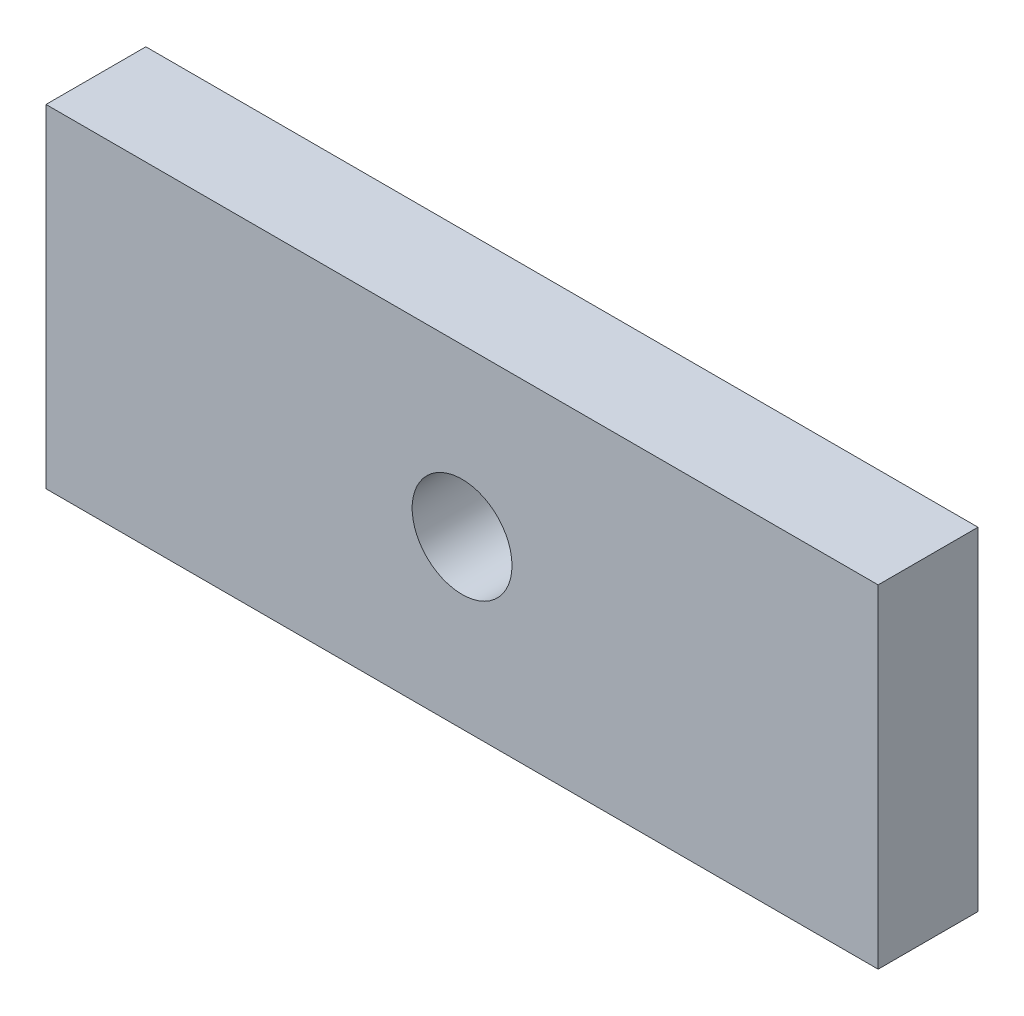
ISO-10303-21;
HEADER;
FILE_DESCRIPTION(('STEP AP214'),'2;1');
FILE_NAME('part.step','',(''),(''),'','','');
FILE_SCHEMA(('AUTOMOTIVE_DESIGN { 1 0 10303 214 1 1 1 1 }'));
ENDSEC;
DATA;
#1=APPLICATION_CONTEXT('core data for automotive mechanical design processes');
#2=APPLICATION_PROTOCOL_DEFINITION('international standard','automotive_design',2000,#1);
#3=PRODUCT_CONTEXT('',#1,'mechanical');
#4=PRODUCT('Part','Part','',(#3));
#5=PRODUCT_RELATED_PRODUCT_CATEGORY('part','',(#4));
#6=PRODUCT_DEFINITION_FORMATION('','',#4);
#7=PRODUCT_DEFINITION_CONTEXT('part definition',#1,'design');
#8=PRODUCT_DEFINITION('design','',#6,#7);
#9=PRODUCT_DEFINITION_SHAPE('','',#8);
#10=(LENGTH_UNIT() NAMED_UNIT(*) SI_UNIT(.MILLI.,.METRE.));
#11=(NAMED_UNIT(*) PLANE_ANGLE_UNIT() SI_UNIT($,.RADIAN.));
#12=(NAMED_UNIT(*) SI_UNIT($,.STERADIAN.) SOLID_ANGLE_UNIT());
#13=UNCERTAINTY_MEASURE_WITH_UNIT(LENGTH_MEASURE(1.E-05),#10,'distance_accuracy_value','');
#14=(GEOMETRIC_REPRESENTATION_CONTEXT(3) GLOBAL_UNCERTAINTY_ASSIGNED_CONTEXT((#13)) GLOBAL_UNIT_ASSIGNED_CONTEXT((#10,
#11,#12)) REPRESENTATION_CONTEXT('',''));
#15=CARTESIAN_POINT('',(0.,0.,0.));
#16=DIRECTION('',(0.,0.,1.));
#17=DIRECTION('',(1.,0.,0.));
#18=AXIS2_PLACEMENT_3D('',#15,#16,#17);
#19=CARTESIAN_POINT('',(0.,0.,3.));
#20=DIRECTION('',(0.,0.,-1.));
#21=DIRECTION('',(-1.,0.,0.));
#22=AXIS2_PLACEMENT_3D('',#19,#20,#21);
#23=PLANE('',#22);
#24=DIRECTION('',(0.,-1.,0.));
#25=VECTOR('',#24,1.);
#26=CARTESIAN_POINT('',(0.,0.,3.));
#27=LINE('',#26,#25);
#28=CARTESIAN_POINT('',(0.,10.,3.));
#29=VERTEX_POINT('',#28);
#30=CARTESIAN_POINT('',(0.,0.,3.));
#31=VERTEX_POINT('',#30);
#32=EDGE_CURVE('E86',#29,#31,#27,.T.);
#33=ORIENTED_EDGE('',*,*,#32,.T.);
#34=DIRECTION('',(1.,0.,0.));
#35=VECTOR('',#34,1.);
#36=CARTESIAN_POINT('',(0.,0.,3.));
#37=LINE('',#36,#35);
#38=CARTESIAN_POINT('',(25.,0.,3.));
#39=VERTEX_POINT('',#38);
#40=EDGE_CURVE('E81',#31,#39,#37,.T.);
#41=ORIENTED_EDGE('',*,*,#40,.T.);
#42=DIRECTION('',(0.,1.,0.));
#43=VECTOR('',#42,1.);
#44=CARTESIAN_POINT('',(25.,0.,3.));
#45=LINE('',#44,#43);
#46=CARTESIAN_POINT('',(25.,10.,3.));
#47=VERTEX_POINT('',#46);
#48=EDGE_CURVE('E84',#39,#47,#45,.T.);
#49=ORIENTED_EDGE('',*,*,#48,.T.);
#50=DIRECTION('',(-1.,0.,0.));
#51=VECTOR('',#50,1.);
#52=CARTESIAN_POINT('',(0.,10.,3.));
#53=LINE('',#52,#51);
#54=EDGE_CURVE('E51',#47,#29,#53,.T.);
#55=ORIENTED_EDGE('',*,*,#54,.T.);
#56=EDGE_LOOP('',(#33,#41,#49,#55));
#57=FACE_BOUND('',#56,.T.);
#58=CARTESIAN_POINT('',(12.5,5.,3.));
#59=DIRECTION('',(0.,0.,1.));
#60=DIRECTION('',(1.,0.,0.));
#61=AXIS2_PLACEMENT_3D('',#58,#59,#60);
#62=CIRCLE('',#61,1.5);
#63=CARTESIAN_POINT('',(14.,5.,3.));
#64=VERTEX_POINT('',#63);
#65=EDGE_CURVE('E101',#64,#64,#62,.T.);
#66=ORIENTED_EDGE('',*,*,#65,.F.);
#67=EDGE_LOOP('',(#66));
#68=FACE_BOUND('',#67,.T.);
#69=ADVANCED_FACE('F34',(#57,#68),#23,.F.);
#70=CARTESIAN_POINT('',(0.,0.,0.));
#71=DIRECTION('',(0.,0.,-1.));
#72=DIRECTION('',(-1.,0.,0.));
#73=AXIS2_PLACEMENT_3D('',#70,#71,#72);
#74=PLANE('',#73);
#75=DIRECTION('',(0.,-1.,0.));
#76=VECTOR('',#75,1.);
#77=CARTESIAN_POINT('',(0.,0.,0.));
#78=LINE('',#77,#76);
#79=CARTESIAN_POINT('',(0.,10.,0.));
#80=VERTEX_POINT('',#79);
#81=CARTESIAN_POINT('',(0.,0.,0.));
#82=VERTEX_POINT('',#81);
#83=EDGE_CURVE('E98',#80,#82,#78,.T.);
#84=ORIENTED_EDGE('',*,*,#83,.F.);
#85=DIRECTION('',(-1.,0.,0.));
#86=VECTOR('',#85,1.);
#87=CARTESIAN_POINT('',(0.,10.,0.));
#88=LINE('',#87,#86);
#89=CARTESIAN_POINT('',(25.,10.,0.));
#90=VERTEX_POINT('',#89);
#91=EDGE_CURVE('E74',#90,#80,#88,.T.);
#92=ORIENTED_EDGE('',*,*,#91,.F.);
#93=DIRECTION('',(0.,1.,0.));
#94=VECTOR('',#93,1.);
#95=CARTESIAN_POINT('',(25.,0.,0.));
#96=LINE('',#95,#94);
#97=CARTESIAN_POINT('',(25.,0.,0.));
#98=VERTEX_POINT('',#97);
#99=EDGE_CURVE('E68',#98,#90,#96,.T.);
#100=ORIENTED_EDGE('',*,*,#99,.F.);
#101=DIRECTION('',(1.,0.,0.));
#102=VECTOR('',#101,1.);
#103=CARTESIAN_POINT('',(0.,0.,0.));
#104=LINE('',#103,#102);
#105=EDGE_CURVE('E90',#82,#98,#104,.T.);
#106=ORIENTED_EDGE('',*,*,#105,.F.);
#107=EDGE_LOOP('',(#84,#92,#100,#106));
#108=FACE_BOUND('',#107,.T.);
#109=CARTESIAN_POINT('',(12.5,5.,0.));
#110=DIRECTION('',(0.,0.,1.));
#111=DIRECTION('',(1.,0.,0.));
#112=AXIS2_PLACEMENT_3D('',#109,#110,#111);
#113=CIRCLE('',#112,1.5);
#114=CARTESIAN_POINT('',(14.,5.,0.));
#115=VERTEX_POINT('',#114);
#116=EDGE_CURVE('E113',#115,#115,#113,.T.);
#117=ORIENTED_EDGE('',*,*,#116,.T.);
#118=EDGE_LOOP('',(#117));
#119=FACE_BOUND('',#118,.T.);
#120=ADVANCED_FACE('F109',(#108,#119),#74,.T.);
#121=CARTESIAN_POINT('',(0.,0.,3.));
#122=DIRECTION('',(1.,0.,0.));
#123=DIRECTION('',(0.,0.,-1.));
#124=AXIS2_PLACEMENT_3D('',#121,#122,#123);
#125=PLANE('',#124);
#126=ORIENTED_EDGE('',*,*,#83,.T.);
#127=DIRECTION('',(0.,0.,-1.));
#128=VECTOR('',#127,1.);
#129=CARTESIAN_POINT('',(0.,0.,3.));
#130=LINE('',#129,#128);
#131=EDGE_CURVE('E11',#31,#82,#130,.T.);
#132=ORIENTED_EDGE('',*,*,#131,.F.);
#133=ORIENTED_EDGE('',*,*,#32,.F.);
#134=DIRECTION('',(0.,0.,-1.));
#135=VECTOR('',#134,1.);
#136=CARTESIAN_POINT('',(0.,10.,3.));
#137=LINE('',#136,#135);
#138=EDGE_CURVE('E94',#29,#80,#137,.T.);
#139=ORIENTED_EDGE('',*,*,#138,.T.);
#140=EDGE_LOOP('',(#126,#132,#133,#139));
#141=FACE_BOUND('',#140,.T.);
#142=ADVANCED_FACE('F36',(#141),#125,.F.);
#143=CARTESIAN_POINT('',(0.,0.,3.));
#144=DIRECTION('',(0.,1.,0.));
#145=DIRECTION('',(0.,0.,1.));
#146=AXIS2_PLACEMENT_3D('',#143,#144,#145);
#147=PLANE('',#146);
#148=ORIENTED_EDGE('',*,*,#105,.T.);
#149=DIRECTION('',(0.,0.,-1.));
#150=VECTOR('',#149,1.);
#151=CARTESIAN_POINT('',(25.,0.,3.));
#152=LINE('',#151,#150);
#153=EDGE_CURVE('E43',#39,#98,#152,.T.);
#154=ORIENTED_EDGE('',*,*,#153,.F.);
#155=ORIENTED_EDGE('',*,*,#40,.F.);
#156=ORIENTED_EDGE('',*,*,#131,.T.);
#157=EDGE_LOOP('',(#148,#154,#155,#156));
#158=FACE_BOUND('',#157,.T.);
#159=ADVANCED_FACE('F89',(#158),#147,.F.);
#160=CARTESIAN_POINT('',(25.,0.,3.));
#161=DIRECTION('',(-1.,0.,0.));
#162=DIRECTION('',(0.,0.,1.));
#163=AXIS2_PLACEMENT_3D('',#160,#161,#162);
#164=PLANE('',#163);
#165=ORIENTED_EDGE('',*,*,#99,.T.);
#166=DIRECTION('',(0.,0.,-1.));
#167=VECTOR('',#166,1.);
#168=CARTESIAN_POINT('',(25.,10.,3.));
#169=LINE('',#168,#167);
#170=EDGE_CURVE('E91',#47,#90,#169,.T.);
#171=ORIENTED_EDGE('',*,*,#170,.F.);
#172=ORIENTED_EDGE('',*,*,#48,.F.);
#173=ORIENTED_EDGE('',*,*,#153,.T.);
#174=EDGE_LOOP('',(#165,#171,#172,#173));
#175=FACE_BOUND('',#174,.T.);
#176=ADVANCED_FACE('F92',(#175),#164,.F.);
#177=CARTESIAN_POINT('',(0.,10.,3.));
#178=DIRECTION('',(0.,-1.,0.));
#179=DIRECTION('',(0.,0.,-1.));
#180=AXIS2_PLACEMENT_3D('',#177,#178,#179);
#181=PLANE('',#180);
#182=ORIENTED_EDGE('',*,*,#91,.T.);
#183=ORIENTED_EDGE('',*,*,#138,.F.);
#184=ORIENTED_EDGE('',*,*,#54,.F.);
#185=ORIENTED_EDGE('',*,*,#170,.T.);
#186=EDGE_LOOP('',(#182,#183,#184,#185));
#187=FACE_BOUND('',#186,.T.);
#188=ADVANCED_FACE('F106',(#187),#181,.F.);
#189=CARTESIAN_POINT('',(12.5,5.,3.));
#190=DIRECTION('',(0.,0.,-1.));
#191=DIRECTION('',(-1.,0.,0.));
#192=AXIS2_PLACEMENT_3D('',#189,#190,#191);
#193=CYLINDRICAL_SURFACE('',#192,1.5);
#194=ORIENTED_EDGE('',*,*,#65,.T.);
#195=EDGE_LOOP('',(#194));
#196=FACE_BOUND('',#195,.T.);
#197=ORIENTED_EDGE('',*,*,#116,.F.);
#198=EDGE_LOOP('',(#197));
#199=FACE_BOUND('',#198,.T.);
#200=ADVANCED_FACE('F119',(#196,#199),#193,.F.);
#201=CLOSED_SHELL('',(#69,#120,#142,#159,#176,#188,#200));
#202=MANIFOLD_SOLID_BREP('B2',#201);
#203=ADVANCED_BREP_SHAPE_REPRESENTATION('',(#18,#202),#14);
#204=SHAPE_DEFINITION_REPRESENTATION(#9,#203);
ENDSEC;
END-ISO-10303-21;
